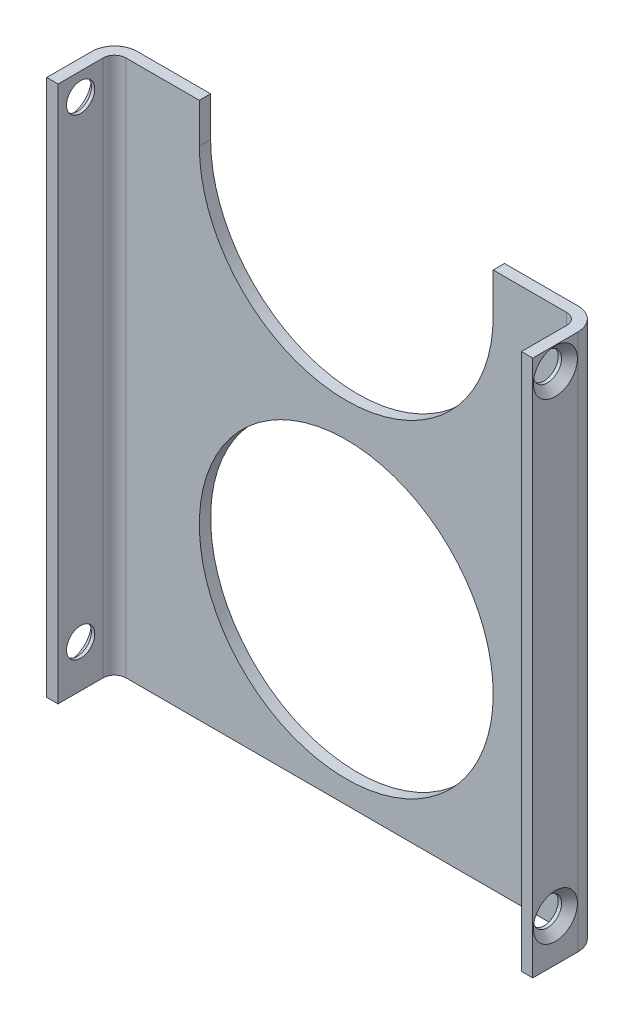
ISO-10303-21;
HEADER;
FILE_DESCRIPTION(('STEP AP214'),'2;1');
FILE_NAME('part.step','',(''),(''),'','','');
FILE_SCHEMA(('AUTOMOTIVE_DESIGN { 1 0 10303 214 1 1 1 1 }'));
ENDSEC;
DATA;
#1=APPLICATION_CONTEXT('core data for automotive mechanical design processes');
#2=APPLICATION_PROTOCOL_DEFINITION('international standard','automotive_design',2000,#1);
#3=PRODUCT_CONTEXT('',#1,'mechanical');
#4=PRODUCT('Part','Part','',(#3));
#5=PRODUCT_RELATED_PRODUCT_CATEGORY('part','',(#4));
#6=PRODUCT_DEFINITION_FORMATION('','',#4);
#7=PRODUCT_DEFINITION_CONTEXT('part definition',#1,'design');
#8=PRODUCT_DEFINITION('design','',#6,#7);
#9=PRODUCT_DEFINITION_SHAPE('','',#8);
#10=(LENGTH_UNIT() NAMED_UNIT(*) SI_UNIT(.MILLI.,.METRE.));
#11=(NAMED_UNIT(*) PLANE_ANGLE_UNIT() SI_UNIT($,.RADIAN.));
#12=(NAMED_UNIT(*) SI_UNIT($,.STERADIAN.) SOLID_ANGLE_UNIT());
#13=UNCERTAINTY_MEASURE_WITH_UNIT(LENGTH_MEASURE(1.E-05),#10,'distance_accuracy_value','');
#14=(GEOMETRIC_REPRESENTATION_CONTEXT(3) GLOBAL_UNCERTAINTY_ASSIGNED_CONTEXT((#13)) GLOBAL_UNIT_ASSIGNED_CONTEXT((#10,
#11,#12)) REPRESENTATION_CONTEXT('',''));
#15=CARTESIAN_POINT('',(0.,0.,0.));
#16=DIRECTION('',(0.,0.,1.));
#17=DIRECTION('',(1.,0.,0.));
#18=AXIS2_PLACEMENT_3D('',#15,#16,#17);
#19=CARTESIAN_POINT('',(0.,0.,2.));
#20=DIRECTION('',(-1.,0.,0.));
#21=DIRECTION('',(0.,0.,1.));
#22=AXIS2_PLACEMENT_3D('',#19,#20,#21);
#23=PLANE('',#22);
#24=CARTESIAN_POINT('',(0.,7.49999999999999,8.));
#25=DIRECTION('',(-1.,0.,0.));
#26=DIRECTION('',(0.,0.,1.));
#27=AXIS2_PLACEMENT_3D('',#24,#25,#26);
#28=CIRCLE('',#27,3.9);
#29=CARTESIAN_POINT('',(0.,7.49999999999999,11.9));
#30=VERTEX_POINT('',#29);
#31=EDGE_CURVE('E299',#30,#30,#28,.T.);
#32=ORIENTED_EDGE('',*,*,#31,.F.);
#33=EDGE_LOOP('',(#32));
#34=FACE_BOUND('',#33,.T.);
#35=DIRECTION('',(0.,0.,-1.));
#36=VECTOR('',#35,1.);
#37=CARTESIAN_POINT('',(0.,95.,2.));
#38=LINE('',#37,#36);
#39=CARTESIAN_POINT('',(0.,94.9999999999999,12.));
#40=VERTEX_POINT('',#39);
#41=CARTESIAN_POINT('',(0.,95.,4.));
#42=VERTEX_POINT('',#41);
#43=EDGE_CURVE('E154',#40,#42,#38,.T.);
#44=ORIENTED_EDGE('',*,*,#43,.T.);
#45=DIRECTION('',(0.,1.,0.));
#46=VECTOR('',#45,1.);
#47=CARTESIAN_POINT('',(0.,88.,4.));
#48=LINE('',#47,#46);
#49=CARTESIAN_POINT('',(0.,0.,4.));
#50=VERTEX_POINT('',#49);
#51=EDGE_CURVE('E286',#42,#50,#48,.F.);
#52=ORIENTED_EDGE('',*,*,#51,.T.);
#53=DIRECTION('',(0.,0.,-1.));
#54=VECTOR('',#53,1.);
#55=CARTESIAN_POINT('',(0.,0.,2.));
#56=LINE('',#55,#54);
#57=CARTESIAN_POINT('',(0.,0.,12.));
#58=VERTEX_POINT('',#57);
#59=EDGE_CURVE('E177',#58,#50,#56,.T.);
#60=ORIENTED_EDGE('',*,*,#59,.F.);
#61=DIRECTION('',(0.,1.,0.));
#62=VECTOR('',#61,1.);
#63=CARTESIAN_POINT('',(0.,0.,12.));
#64=LINE('',#63,#62);
#65=EDGE_CURVE('E171',#58,#40,#64,.T.);
#66=ORIENTED_EDGE('',*,*,#65,.T.);
#67=EDGE_LOOP('',(#44,#52,#60,#66));
#68=FACE_BOUND('',#67,.T.);
#69=CARTESIAN_POINT('',(0.,91.,8.));
#70=DIRECTION('',(-1.,0.,0.));
#71=DIRECTION('',(0.,0.,1.));
#72=AXIS2_PLACEMENT_3D('',#69,#70,#71);
#73=CIRCLE('',#72,3.9);
#74=CARTESIAN_POINT('',(0.,91.,11.9));
#75=VERTEX_POINT('',#74);
#76=EDGE_CURVE('E516',#75,#75,#73,.T.);
#77=ORIENTED_EDGE('',*,*,#76,.F.);
#78=EDGE_LOOP('',(#77));
#79=FACE_BOUND('',#78,.T.);
#80=ADVANCED_FACE('F42',(#34,#68,#79),#23,.T.);
#81=CARTESIAN_POINT('',(1.99999999999999,94.9999999999999,12.));
#82=DIRECTION('',(1.,0.,0.));
#83=DIRECTION('',(0.,1.,0.));
#84=AXIS2_PLACEMENT_3D('',#81,#82,#83);
#85=PLANE('',#84);
#86=CARTESIAN_POINT('',(2.,7.49999999999999,8.));
#87=DIRECTION('',(1.,0.,0.));
#88=DIRECTION('',(0.,1.,0.));
#89=AXIS2_PLACEMENT_3D('',#86,#87,#88);
#90=CIRCLE('',#89,2.5);
#91=CARTESIAN_POINT('',(2.,9.99999999999999,8.));
#92=VERTEX_POINT('',#91);
#93=EDGE_CURVE('E296',#92,#92,#90,.F.);
#94=ORIENTED_EDGE('',*,*,#93,.T.);
#95=EDGE_LOOP('',(#94));
#96=FACE_BOUND('',#95,.T.);
#97=DIRECTION('',(0.,0.,-1.));
#98=VECTOR('',#97,1.);
#99=CARTESIAN_POINT('',(2.,0.,12.));
#100=LINE('',#99,#98);
#101=CARTESIAN_POINT('',(2.,0.,12.));
#102=VERTEX_POINT('',#101);
#103=CARTESIAN_POINT('',(2.,0.,4.));
#104=VERTEX_POINT('',#103);
#105=EDGE_CURVE('E191',#102,#104,#100,.T.);
#106=ORIENTED_EDGE('',*,*,#105,.T.);
#107=DIRECTION('',(0.,1.,0.));
#108=VECTOR('',#107,1.);
#109=CARTESIAN_POINT('',(1.99999999999999,94.9999999999999,4.));
#110=LINE('',#109,#108);
#111=CARTESIAN_POINT('',(1.99999999999999,94.9999999999999,4.));
#112=VERTEX_POINT('',#111);
#113=EDGE_CURVE('E248',#104,#112,#110,.T.);
#114=ORIENTED_EDGE('',*,*,#113,.T.);
#115=DIRECTION('',(0.,0.,-1.));
#116=VECTOR('',#115,1.);
#117=CARTESIAN_POINT('',(1.99999999999999,94.9999999999999,12.));
#118=LINE('',#117,#116);
#119=CARTESIAN_POINT('',(1.99999999999999,94.9999999999999,12.));
#120=VERTEX_POINT('',#119);
#121=EDGE_CURVE('E190',#120,#112,#118,.T.);
#122=ORIENTED_EDGE('',*,*,#121,.F.);
#123=DIRECTION('',(0.,-1.,0.));
#124=VECTOR('',#123,1.);
#125=CARTESIAN_POINT('',(1.99999999999999,94.9999999999999,12.));
#126=LINE('',#125,#124);
#127=EDGE_CURVE('E173',#120,#102,#126,.T.);
#128=ORIENTED_EDGE('',*,*,#127,.T.);
#129=EDGE_LOOP('',(#106,#114,#122,#128));
#130=FACE_BOUND('',#129,.T.);
#131=CARTESIAN_POINT('',(1.99999999999999,91.,8.));
#132=DIRECTION('',(1.,0.,0.));
#133=DIRECTION('',(0.,1.,0.));
#134=AXIS2_PLACEMENT_3D('',#131,#132,#133);
#135=CIRCLE('',#134,2.5);
#136=CARTESIAN_POINT('',(1.99999999999999,93.5,8.));
#137=VERTEX_POINT('',#136);
#138=EDGE_CURVE('E45',#137,#137,#135,.F.);
#139=ORIENTED_EDGE('',*,*,#138,.T.);
#140=EDGE_LOOP('',(#139));
#141=FACE_BOUND('',#140,.T.);
#142=ADVANCED_FACE('F337',(#96,#130,#141),#85,.T.);
#143=CARTESIAN_POINT('',(86.,95.,2.));
#144=DIRECTION('',(1.,0.,0.));
#145=DIRECTION('',(0.,1.,0.));
#146=AXIS2_PLACEMENT_3D('',#143,#144,#145);
#147=PLANE('',#146);
#148=CARTESIAN_POINT('',(86.,91.,8.));
#149=DIRECTION('',(1.,0.,0.));
#150=DIRECTION('',(0.,0.,-1.));
#151=AXIS2_PLACEMENT_3D('',#148,#149,#150);
#152=CIRCLE('',#151,3.9);
#153=CARTESIAN_POINT('',(86.,91.,4.1));
#154=VERTEX_POINT('',#153);
#155=EDGE_CURVE('E294',#154,#154,#152,.T.);
#156=ORIENTED_EDGE('',*,*,#155,.F.);
#157=EDGE_LOOP('',(#156));
#158=FACE_BOUND('',#157,.T.);
#159=DIRECTION('',(0.,0.,-1.));
#160=VECTOR('',#159,1.);
#161=CARTESIAN_POINT('',(86.,0.,2.));
#162=LINE('',#161,#160);
#163=CARTESIAN_POINT('',(86.,0.,12.));
#164=VERTEX_POINT('',#163);
#165=CARTESIAN_POINT('',(86.,0.,4.));
#166=VERTEX_POINT('',#165);
#167=EDGE_CURVE('E249',#164,#166,#162,.T.);
#168=ORIENTED_EDGE('',*,*,#167,.T.);
#169=DIRECTION('',(0.,-1.,0.));
#170=VECTOR('',#169,1.);
#171=CARTESIAN_POINT('',(86.,88.,4.));
#172=LINE('',#171,#170);
#173=CARTESIAN_POINT('',(86.,95.,4.));
#174=VERTEX_POINT('',#173);
#175=EDGE_CURVE('E50',#166,#174,#172,.F.);
#176=ORIENTED_EDGE('',*,*,#175,.T.);
#177=DIRECTION('',(0.,0.,-1.));
#178=VECTOR('',#177,1.);
#179=CARTESIAN_POINT('',(86.,95.,2.));
#180=LINE('',#179,#178);
#181=CARTESIAN_POINT('',(86.,95.,12.));
#182=VERTEX_POINT('',#181);
#183=EDGE_CURVE('E251',#182,#174,#180,.T.);
#184=ORIENTED_EDGE('',*,*,#183,.F.);
#185=DIRECTION('',(0.,-1.,0.));
#186=VECTOR('',#185,1.);
#187=CARTESIAN_POINT('',(86.,95.,12.));
#188=LINE('',#187,#186);
#189=EDGE_CURVE('E194',#182,#164,#188,.T.);
#190=ORIENTED_EDGE('',*,*,#189,.T.);
#191=EDGE_LOOP('',(#168,#176,#184,#190));
#192=FACE_BOUND('',#191,.T.);
#193=CARTESIAN_POINT('',(86.,7.49999999999999,8.));
#194=DIRECTION('',(1.,0.,0.));
#195=DIRECTION('',(0.,0.,-1.));
#196=AXIS2_PLACEMENT_3D('',#193,#194,#195);
#197=CIRCLE('',#196,3.9);
#198=CARTESIAN_POINT('',(86.,7.49999999999999,4.1));
#199=VERTEX_POINT('',#198);
#200=EDGE_CURVE('E298',#199,#199,#197,.T.);
#201=ORIENTED_EDGE('',*,*,#200,.F.);
#202=EDGE_LOOP('',(#201));
#203=FACE_BOUND('',#202,.T.);
#204=ADVANCED_FACE('F342',(#158,#192,#203),#147,.T.);
#205=CARTESIAN_POINT('',(84.,0.,12.));
#206=DIRECTION('',(-1.,0.,0.));
#207=DIRECTION('',(0.,0.,1.));
#208=AXIS2_PLACEMENT_3D('',#205,#206,#207);
#209=PLANE('',#208);
#210=CARTESIAN_POINT('',(84.,91.,8.));
#211=DIRECTION('',(-1.,0.,0.));
#212=DIRECTION('',(0.,0.,1.));
#213=AXIS2_PLACEMENT_3D('',#210,#211,#212);
#214=CIRCLE('',#213,2.5);
#215=CARTESIAN_POINT('',(84.,91.,10.5));
#216=VERTEX_POINT('',#215);
#217=EDGE_CURVE('E179',#216,#216,#214,.F.);
#218=ORIENTED_EDGE('',*,*,#217,.T.);
#219=EDGE_LOOP('',(#218));
#220=FACE_BOUND('',#219,.T.);
#221=DIRECTION('',(0.,0.,-1.));
#222=VECTOR('',#221,1.);
#223=CARTESIAN_POINT('',(84.,95.,12.));
#224=LINE('',#223,#222);
#225=CARTESIAN_POINT('',(84.,95.,12.));
#226=VERTEX_POINT('',#225);
#227=CARTESIAN_POINT('',(84.,95.,4.));
#228=VERTEX_POINT('',#227);
#229=EDGE_CURVE('E207',#226,#228,#224,.T.);
#230=ORIENTED_EDGE('',*,*,#229,.T.);
#231=DIRECTION('',(0.,-1.,0.));
#232=VECTOR('',#231,1.);
#233=CARTESIAN_POINT('',(84.,0.,4.));
#234=LINE('',#233,#232);
#235=CARTESIAN_POINT('',(84.,0.,4.));
#236=VERTEX_POINT('',#235);
#237=EDGE_CURVE('E268',#228,#236,#234,.T.);
#238=ORIENTED_EDGE('',*,*,#237,.T.);
#239=DIRECTION('',(0.,0.,-1.));
#240=VECTOR('',#239,1.);
#241=CARTESIAN_POINT('',(84.,0.,12.));
#242=LINE('',#241,#240);
#243=CARTESIAN_POINT('',(84.,0.,12.));
#244=VERTEX_POINT('',#243);
#245=EDGE_CURVE('E206',#244,#236,#242,.T.);
#246=ORIENTED_EDGE('',*,*,#245,.F.);
#247=DIRECTION('',(0.,1.,0.));
#248=VECTOR('',#247,1.);
#249=CARTESIAN_POINT('',(84.,0.,12.));
#250=LINE('',#249,#248);
#251=EDGE_CURVE('E201',#244,#226,#250,.T.);
#252=ORIENTED_EDGE('',*,*,#251,.T.);
#253=EDGE_LOOP('',(#230,#238,#246,#252));
#254=FACE_BOUND('',#253,.T.);
#255=CARTESIAN_POINT('',(84.,7.49999999999999,8.));
#256=DIRECTION('',(-1.,0.,0.));
#257=DIRECTION('',(0.,0.,1.));
#258=AXIS2_PLACEMENT_3D('',#255,#256,#257);
#259=CIRCLE('',#258,2.49999999999999);
#260=CARTESIAN_POINT('',(84.,7.49999999999999,10.5));
#261=VERTEX_POINT('',#260);
#262=EDGE_CURVE('E292',#261,#261,#259,.F.);
#263=ORIENTED_EDGE('',*,*,#262,.T.);
#264=EDGE_LOOP('',(#263));
#265=FACE_BOUND('',#264,.T.);
#266=ADVANCED_FACE('F347',(#220,#254,#265),#209,.T.);
#267=CARTESIAN_POINT('',(43.,88.,2.));
#268=DIRECTION('',(0.,0.,1.));
#269=DIRECTION('',(1.,0.,0.));
#270=AXIS2_PLACEMENT_3D('',#267,#268,#269);
#271=PLANE('',#270);
#272=DIRECTION('',(-1.,0.,0.));
#273=VECTOR('',#272,1.);
#274=CARTESIAN_POINT('',(17.,95.,2.));
#275=LINE('',#274,#273);
#276=CARTESIAN_POINT('',(17.,95.,2.));
#277=VERTEX_POINT('',#276);
#278=CARTESIAN_POINT('',(3.99999999999999,95.,2.));
#279=VERTEX_POINT('',#278);
#280=EDGE_CURVE('E232',#277,#279,#275,.T.);
#281=ORIENTED_EDGE('',*,*,#280,.T.);
#282=DIRECTION('',(0.,1.,0.));
#283=VECTOR('',#282,1.);
#284=CARTESIAN_POINT('',(3.99999999999999,94.9999999999999,2.));
#285=LINE('',#284,#283);
#286=CARTESIAN_POINT('',(4.,0.,2.));
#287=VERTEX_POINT('',#286);
#288=EDGE_CURVE('E266',#279,#287,#285,.F.);
#289=ORIENTED_EDGE('',*,*,#288,.T.);
#290=DIRECTION('',(1.,0.,0.));
#291=VECTOR('',#290,1.);
#292=CARTESIAN_POINT('',(0.,0.,2.));
#293=LINE('',#292,#291);
#294=CARTESIAN_POINT('',(82.,0.,2.));
#295=VERTEX_POINT('',#294);
#296=EDGE_CURVE('E166',#287,#295,#293,.T.);
#297=ORIENTED_EDGE('',*,*,#296,.T.);
#298=DIRECTION('',(0.,-1.,0.));
#299=VECTOR('',#298,1.);
#300=CARTESIAN_POINT('',(82.,0.,2.));
#301=LINE('',#300,#299);
#302=CARTESIAN_POINT('',(82.,95.,2.));
#303=VERTEX_POINT('',#302);
#304=EDGE_CURVE('E264',#295,#303,#301,.F.);
#305=ORIENTED_EDGE('',*,*,#304,.T.);
#306=DIRECTION('',(-1.,0.,0.));
#307=VECTOR('',#306,1.);
#308=CARTESIAN_POINT('',(86.,95.,2.));
#309=LINE('',#308,#307);
#310=CARTESIAN_POINT('',(69.,95.,2.));
#311=VERTEX_POINT('',#310);
#312=EDGE_CURVE('E243',#303,#311,#309,.T.);
#313=ORIENTED_EDGE('',*,*,#312,.T.);
#314=DIRECTION('',(0.,1.,0.));
#315=VECTOR('',#314,1.);
#316=CARTESIAN_POINT('',(69.,88.,2.));
#317=LINE('',#316,#315);
#318=CARTESIAN_POINT('',(69.,88.,2.));
#319=VERTEX_POINT('',#318);
#320=EDGE_CURVE('E240',#319,#311,#317,.T.);
#321=ORIENTED_EDGE('',*,*,#320,.F.);
#322=CARTESIAN_POINT('',(43.,88.,2.));
#323=DIRECTION('',(0.,0.,1.));
#324=DIRECTION('',(1.,0.,0.));
#325=AXIS2_PLACEMENT_3D('',#322,#323,#324);
#326=CIRCLE('',#325,26.);
#327=CARTESIAN_POINT('',(17.,88.,2.));
#328=VERTEX_POINT('',#327);
#329=EDGE_CURVE('E237',#328,#319,#326,.T.);
#330=ORIENTED_EDGE('',*,*,#329,.F.);
#331=DIRECTION('',(0.,1.,0.));
#332=VECTOR('',#331,1.);
#333=CARTESIAN_POINT('',(17.,88.,2.));
#334=LINE('',#333,#332);
#335=EDGE_CURVE('E235',#328,#277,#334,.T.);
#336=ORIENTED_EDGE('',*,*,#335,.T.);
#337=EDGE_LOOP('',(#281,#289,#297,#305,#313,#321,#330,#336));
#338=FACE_BOUND('',#337,.T.);
#339=CARTESIAN_POINT('',(43.,30.,2.));
#340=DIRECTION('',(0.,0.,1.));
#341=DIRECTION('',(1.,0.,0.));
#342=AXIS2_PLACEMENT_3D('',#339,#340,#341);
#343=CIRCLE('',#342,26.);
#344=CARTESIAN_POINT('',(69.,30.,2.));
#345=VERTEX_POINT('',#344);
#346=EDGE_CURVE('E215',#345,#345,#343,.T.);
#347=ORIENTED_EDGE('',*,*,#346,.F.);
#348=EDGE_LOOP('',(#347));
#349=FACE_BOUND('',#348,.T.);
#350=ADVANCED_FACE('F361',(#338,#349),#271,.T.);
#351=CARTESIAN_POINT('',(43.,88.,0.));
#352=DIRECTION('',(0.,0.,1.));
#353=DIRECTION('',(1.,0.,0.));
#354=AXIS2_PLACEMENT_3D('',#351,#352,#353);
#355=PLANE('',#354);
#356=DIRECTION('',(1.,0.,0.));
#357=VECTOR('',#356,1.);
#358=CARTESIAN_POINT('',(0.,0.,0.));
#359=LINE('',#358,#357);
#360=CARTESIAN_POINT('',(4.,0.,0.));
#361=VERTEX_POINT('',#360);
#362=CARTESIAN_POINT('',(82.,0.,0.));
#363=VERTEX_POINT('',#362);
#364=EDGE_CURVE('E230',#361,#363,#359,.T.);
#365=ORIENTED_EDGE('',*,*,#364,.F.);
#366=DIRECTION('',(0.,1.,0.));
#367=VECTOR('',#366,1.);
#368=CARTESIAN_POINT('',(4.,88.,0.));
#369=LINE('',#368,#367);
#370=CARTESIAN_POINT('',(4.,95.,0.));
#371=VERTEX_POINT('',#370);
#372=EDGE_CURVE('E282',#361,#371,#369,.T.);
#373=ORIENTED_EDGE('',*,*,#372,.T.);
#374=DIRECTION('',(-1.,0.,0.));
#375=VECTOR('',#374,1.);
#376=CARTESIAN_POINT('',(17.,95.,0.));
#377=LINE('',#376,#375);
#378=CARTESIAN_POINT('',(17.,95.,0.));
#379=VERTEX_POINT('',#378);
#380=EDGE_CURVE('E218',#379,#371,#377,.T.);
#381=ORIENTED_EDGE('',*,*,#380,.F.);
#382=DIRECTION('',(0.,1.,0.));
#383=VECTOR('',#382,1.);
#384=CARTESIAN_POINT('',(17.,88.,0.));
#385=LINE('',#384,#383);
#386=CARTESIAN_POINT('',(17.,88.,0.));
#387=VERTEX_POINT('',#386);
#388=EDGE_CURVE('E220',#387,#379,#385,.T.);
#389=ORIENTED_EDGE('',*,*,#388,.F.);
#390=CARTESIAN_POINT('',(43.,88.,0.));
#391=DIRECTION('',(0.,0.,1.));
#392=DIRECTION('',(1.,0.,0.));
#393=AXIS2_PLACEMENT_3D('',#390,#391,#392);
#394=CIRCLE('',#393,26.);
#395=CARTESIAN_POINT('',(69.,88.,0.));
#396=VERTEX_POINT('',#395);
#397=EDGE_CURVE('E222',#387,#396,#394,.T.);
#398=ORIENTED_EDGE('',*,*,#397,.T.);
#399=DIRECTION('',(0.,1.,0.));
#400=VECTOR('',#399,1.);
#401=CARTESIAN_POINT('',(69.,88.,0.));
#402=LINE('',#401,#400);
#403=CARTESIAN_POINT('',(69.,95.,0.));
#404=VERTEX_POINT('',#403);
#405=EDGE_CURVE('E225',#396,#404,#402,.T.);
#406=ORIENTED_EDGE('',*,*,#405,.T.);
#407=DIRECTION('',(-1.,0.,0.));
#408=VECTOR('',#407,1.);
#409=CARTESIAN_POINT('',(86.,95.,0.));
#410=LINE('',#409,#408);
#411=CARTESIAN_POINT('',(82.,95.,0.));
#412=VERTEX_POINT('',#411);
#413=EDGE_CURVE('E228',#412,#404,#410,.T.);
#414=ORIENTED_EDGE('',*,*,#413,.F.);
#415=DIRECTION('',(0.,-1.,0.));
#416=VECTOR('',#415,1.);
#417=CARTESIAN_POINT('',(82.,88.,0.));
#418=LINE('',#417,#416);
#419=EDGE_CURVE('E279',#412,#363,#418,.T.);
#420=ORIENTED_EDGE('',*,*,#419,.T.);
#421=EDGE_LOOP('',(#365,#373,#381,#389,#398,#406,#414,#420));
#422=FACE_BOUND('',#421,.T.);
#423=CARTESIAN_POINT('',(43.,30.,0.));
#424=DIRECTION('',(0.,0.,1.));
#425=DIRECTION('',(1.,0.,0.));
#426=AXIS2_PLACEMENT_3D('',#423,#424,#425);
#427=CIRCLE('',#426,26.);
#428=CARTESIAN_POINT('',(69.,30.,0.));
#429=VERTEX_POINT('',#428);
#430=EDGE_CURVE('E210',#429,#429,#427,.T.);
#431=ORIENTED_EDGE('',*,*,#430,.T.);
#432=EDGE_LOOP('',(#431));
#433=FACE_BOUND('',#432,.T.);
#434=ADVANCED_FACE('F366',(#422,#433),#355,.F.);
#435=CARTESIAN_POINT('',(0.,0.,2.));
#436=DIRECTION('',(0.,1.,0.));
#437=DIRECTION('',(0.,0.,1.));
#438=AXIS2_PLACEMENT_3D('',#435,#436,#437);
#439=PLANE('',#438);
#440=ORIENTED_EDGE('',*,*,#59,.T.);
#441=CARTESIAN_POINT('',(4.,0.,4.));
#442=DIRECTION('',(0.,1.,0.));
#443=DIRECTION('',(0.,0.,1.));
#444=AXIS2_PLACEMENT_3D('',#441,#442,#443);
#445=CIRCLE('',#444,4.);
#446=EDGE_CURVE('E289',#50,#361,#445,.F.);
#447=ORIENTED_EDGE('',*,*,#446,.T.);
#448=ORIENTED_EDGE('',*,*,#364,.T.);
#449=CARTESIAN_POINT('',(82.,0.,4.));
#450=DIRECTION('',(0.,1.,0.));
#451=DIRECTION('',(0.,0.,1.));
#452=AXIS2_PLACEMENT_3D('',#449,#450,#451);
#453=CIRCLE('',#452,4.);
#454=EDGE_CURVE('E65',#363,#166,#453,.F.);
#455=ORIENTED_EDGE('',*,*,#454,.T.);
#456=ORIENTED_EDGE('',*,*,#167,.F.);
#457=DIRECTION('',(1.,0.,0.));
#458=VECTOR('',#457,1.);
#459=CARTESIAN_POINT('',(84.,0.,12.));
#460=LINE('',#459,#458);
#461=EDGE_CURVE('E198',#244,#164,#460,.T.);
#462=ORIENTED_EDGE('',*,*,#461,.F.);
#463=ORIENTED_EDGE('',*,*,#245,.T.);
#464=CARTESIAN_POINT('',(82.,0.,4.));
#465=DIRECTION('',(0.,1.,0.));
#466=DIRECTION('',(0.,0.,1.));
#467=AXIS2_PLACEMENT_3D('',#464,#465,#466);
#468=CIRCLE('',#467,2.);
#469=EDGE_CURVE('E275',#236,#295,#468,.T.);
#470=ORIENTED_EDGE('',*,*,#469,.T.);
#471=ORIENTED_EDGE('',*,*,#296,.F.);
#472=CARTESIAN_POINT('',(4.,0.,4.));
#473=DIRECTION('',(0.,1.,0.));
#474=DIRECTION('',(0.,0.,1.));
#475=AXIS2_PLACEMENT_3D('',#472,#473,#474);
#476=CIRCLE('',#475,2.);
#477=EDGE_CURVE('E273',#287,#104,#476,.T.);
#478=ORIENTED_EDGE('',*,*,#477,.T.);
#479=ORIENTED_EDGE('',*,*,#105,.F.);
#480=DIRECTION('',(1.,0.,0.));
#481=VECTOR('',#480,1.);
#482=CARTESIAN_POINT('',(0.,0.,12.));
#483=LINE('',#482,#481);
#484=EDGE_CURVE('E188',#58,#102,#483,.T.);
#485=ORIENTED_EDGE('',*,*,#484,.F.);
#486=EDGE_LOOP('',(#440,#447,#448,#455,#456,#462,#463,#470,#471,#478,#479,#485));
#487=FACE_BOUND('',#486,.T.);
#488=ADVANCED_FACE('F369',(#487),#439,.F.);
#489=CARTESIAN_POINT('',(86.,95.,2.));
#490=DIRECTION('',(0.,-1.,0.));
#491=DIRECTION('',(1.,0.,0.));
#492=AXIS2_PLACEMENT_3D('',#489,#490,#491);
#493=PLANE('',#492);
#494=ORIENTED_EDGE('',*,*,#183,.T.);
#495=CARTESIAN_POINT('',(82.,95.,4.));
#496=DIRECTION('',(0.,-1.,0.));
#497=DIRECTION('',(1.,0.,0.));
#498=AXIS2_PLACEMENT_3D('',#495,#496,#497);
#499=CIRCLE('',#498,4.);
#500=EDGE_CURVE('E13',#174,#412,#499,.F.);
#501=ORIENTED_EDGE('',*,*,#500,.T.);
#502=ORIENTED_EDGE('',*,*,#413,.T.);
#503=DIRECTION('',(0.,0.,-1.));
#504=VECTOR('',#503,1.);
#505=CARTESIAN_POINT('',(69.,95.,2.));
#506=LINE('',#505,#504);
#507=EDGE_CURVE('E253',#311,#404,#506,.T.);
#508=ORIENTED_EDGE('',*,*,#507,.F.);
#509=ORIENTED_EDGE('',*,*,#312,.F.);
#510=CARTESIAN_POINT('',(82.,95.,4.));
#511=DIRECTION('',(0.,-1.,0.));
#512=DIRECTION('',(1.,0.,0.));
#513=AXIS2_PLACEMENT_3D('',#510,#511,#512);
#514=CIRCLE('',#513,2.);
#515=EDGE_CURVE('E277',#303,#228,#514,.T.);
#516=ORIENTED_EDGE('',*,*,#515,.T.);
#517=ORIENTED_EDGE('',*,*,#229,.F.);
#518=DIRECTION('',(-1.,0.,0.));
#519=VECTOR('',#518,1.);
#520=CARTESIAN_POINT('',(86.,95.,12.));
#521=LINE('',#520,#519);
#522=EDGE_CURVE('E204',#182,#226,#521,.T.);
#523=ORIENTED_EDGE('',*,*,#522,.F.);
#524=EDGE_LOOP('',(#494,#501,#502,#508,#509,#516,#517,#523));
#525=FACE_BOUND('',#524,.T.);
#526=ADVANCED_FACE('F375',(#525),#493,.F.);
#527=CARTESIAN_POINT('',(69.,88.,2.));
#528=DIRECTION('',(-1.,0.,0.));
#529=DIRECTION('',(0.,-1.,0.));
#530=AXIS2_PLACEMENT_3D('',#527,#528,#529);
#531=PLANE('',#530);
#532=ORIENTED_EDGE('',*,*,#405,.F.);
#533=DIRECTION('',(0.,0.,-1.));
#534=VECTOR('',#533,1.);
#535=CARTESIAN_POINT('',(69.,88.,2.));
#536=LINE('',#535,#534);
#537=EDGE_CURVE('E256',#319,#396,#536,.T.);
#538=ORIENTED_EDGE('',*,*,#537,.F.);
#539=ORIENTED_EDGE('',*,*,#320,.T.);
#540=ORIENTED_EDGE('',*,*,#507,.T.);
#541=EDGE_LOOP('',(#532,#538,#539,#540));
#542=FACE_BOUND('',#541,.T.);
#543=ADVANCED_FACE('F379',(#542),#531,.T.);
#544=CARTESIAN_POINT('',(43.,88.,2.));
#545=DIRECTION('',(0.,0.,-1.));
#546=DIRECTION('',(-1.,0.,0.));
#547=AXIS2_PLACEMENT_3D('',#544,#545,#546);
#548=CYLINDRICAL_SURFACE('',#547,26.);
#549=ORIENTED_EDGE('',*,*,#397,.F.);
#550=DIRECTION('',(0.,0.,-1.));
#551=VECTOR('',#550,1.);
#552=CARTESIAN_POINT('',(17.,88.,2.));
#553=LINE('',#552,#551);
#554=EDGE_CURVE('E258',#328,#387,#553,.T.);
#555=ORIENTED_EDGE('',*,*,#554,.F.);
#556=ORIENTED_EDGE('',*,*,#329,.T.);
#557=ORIENTED_EDGE('',*,*,#537,.T.);
#558=EDGE_LOOP('',(#549,#555,#556,#557));
#559=FACE_BOUND('',#558,.T.);
#560=ADVANCED_FACE('F383',(#559),#548,.F.);
#561=CARTESIAN_POINT('',(17.,88.,2.));
#562=DIRECTION('',(-1.,0.,0.));
#563=DIRECTION('',(0.,-1.,0.));
#564=AXIS2_PLACEMENT_3D('',#561,#562,#563);
#565=PLANE('',#564);
#566=ORIENTED_EDGE('',*,*,#388,.T.);
#567=DIRECTION('',(0.,0.,-1.));
#568=VECTOR('',#567,1.);
#569=CARTESIAN_POINT('',(17.,95.,2.));
#570=LINE('',#569,#568);
#571=EDGE_CURVE('E165',#277,#379,#570,.T.);
#572=ORIENTED_EDGE('',*,*,#571,.F.);
#573=ORIENTED_EDGE('',*,*,#335,.F.);
#574=ORIENTED_EDGE('',*,*,#554,.T.);
#575=EDGE_LOOP('',(#566,#572,#573,#574));
#576=FACE_BOUND('',#575,.T.);
#577=ADVANCED_FACE('F387',(#576),#565,.F.);
#578=CARTESIAN_POINT('',(17.,95.,2.));
#579=DIRECTION('',(0.,-1.,0.));
#580=DIRECTION('',(1.,0.,0.));
#581=AXIS2_PLACEMENT_3D('',#578,#579,#580);
#582=PLANE('',#581);
#583=ORIENTED_EDGE('',*,*,#380,.T.);
#584=CARTESIAN_POINT('',(4.,95.,4.));
#585=DIRECTION('',(0.,-1.,0.));
#586=DIRECTION('',(1.,0.,0.));
#587=AXIS2_PLACEMENT_3D('',#584,#585,#586);
#588=CIRCLE('',#587,4.);
#589=EDGE_CURVE('E161',#371,#42,#588,.F.);
#590=ORIENTED_EDGE('',*,*,#589,.T.);
#591=ORIENTED_EDGE('',*,*,#43,.F.);
#592=DIRECTION('',(-1.,0.,0.));
#593=VECTOR('',#592,1.);
#594=CARTESIAN_POINT('',(1.99999999999999,94.9999999999999,12.));
#595=LINE('',#594,#593);
#596=EDGE_CURVE('E159',#120,#40,#595,.T.);
#597=ORIENTED_EDGE('',*,*,#596,.F.);
#598=ORIENTED_EDGE('',*,*,#121,.T.);
#599=CARTESIAN_POINT('',(3.99999999999999,95.,4.));
#600=DIRECTION('',(0.,-1.,0.));
#601=DIRECTION('',(1.,0.,0.));
#602=AXIS2_PLACEMENT_3D('',#599,#600,#601);
#603=CIRCLE('',#602,2.);
#604=EDGE_CURVE('E271',#112,#279,#603,.T.);
#605=ORIENTED_EDGE('',*,*,#604,.T.);
#606=ORIENTED_EDGE('',*,*,#280,.F.);
#607=ORIENTED_EDGE('',*,*,#571,.T.);
#608=EDGE_LOOP('',(#583,#590,#591,#597,#598,#605,#606,#607));
#609=FACE_BOUND('',#608,.T.);
#610=ADVANCED_FACE('F157',(#609),#582,.F.);
#611=CARTESIAN_POINT('',(43.,30.,2.));
#612=DIRECTION('',(0.,0.,-1.));
#613=DIRECTION('',(-1.,0.,0.));
#614=AXIS2_PLACEMENT_3D('',#611,#612,#613);
#615=CYLINDRICAL_SURFACE('',#614,26.);
#616=ORIENTED_EDGE('',*,*,#346,.T.);
#617=EDGE_LOOP('',(#616));
#618=FACE_BOUND('',#617,.T.);
#619=ORIENTED_EDGE('',*,*,#430,.F.);
#620=EDGE_LOOP('',(#619));
#621=FACE_BOUND('',#620,.T.);
#622=ADVANCED_FACE('F357',(#618,#621),#615,.F.);
#623=CARTESIAN_POINT('',(86.,0.,12.));
#624=DIRECTION('',(0.,0.,1.));
#625=DIRECTION('',(1.,0.,0.));
#626=AXIS2_PLACEMENT_3D('',#623,#624,#625);
#627=PLANE('',#626);
#628=ORIENTED_EDGE('',*,*,#189,.F.);
#629=ORIENTED_EDGE('',*,*,#522,.T.);
#630=ORIENTED_EDGE('',*,*,#251,.F.);
#631=ORIENTED_EDGE('',*,*,#461,.T.);
#632=EDGE_LOOP('',(#628,#629,#630,#631));
#633=FACE_BOUND('',#632,.T.);
#634=ADVANCED_FACE('F354',(#633),#627,.T.);
#635=CARTESIAN_POINT('',(0.,0.,12.));
#636=DIRECTION('',(0.,0.,-1.));
#637=DIRECTION('',(-1.,0.,0.));
#638=AXIS2_PLACEMENT_3D('',#635,#636,#637);
#639=PLANE('',#638);
#640=ORIENTED_EDGE('',*,*,#65,.F.);
#641=ORIENTED_EDGE('',*,*,#484,.T.);
#642=ORIENTED_EDGE('',*,*,#127,.F.);
#643=ORIENTED_EDGE('',*,*,#596,.T.);
#644=EDGE_LOOP('',(#640,#641,#642,#643));
#645=FACE_BOUND('',#644,.T.);
#646=ADVANCED_FACE('F170',(#645),#639,.F.);
#647=CARTESIAN_POINT('',(3.99999999999999,94.9999999999999,4.));
#648=DIRECTION('',(0.,-1.,0.));
#649=DIRECTION('',(1.,0.,0.));
#650=AXIS2_PLACEMENT_3D('',#647,#648,#649);
#651=CYLINDRICAL_SURFACE('',#650,2.);
#652=ORIENTED_EDGE('',*,*,#477,.F.);
#653=ORIENTED_EDGE('',*,*,#288,.F.);
#654=ORIENTED_EDGE('',*,*,#604,.F.);
#655=ORIENTED_EDGE('',*,*,#113,.F.);
#656=EDGE_LOOP('',(#652,#653,#654,#655));
#657=FACE_BOUND('',#656,.T.);
#658=ADVANCED_FACE('F410',(#657),#651,.F.);
#659=CARTESIAN_POINT('',(82.,0.,4.));
#660=DIRECTION('',(0.,1.,0.));
#661=DIRECTION('',(0.,0.,1.));
#662=AXIS2_PLACEMENT_3D('',#659,#660,#661);
#663=CYLINDRICAL_SURFACE('',#662,2.);
#664=ORIENTED_EDGE('',*,*,#515,.F.);
#665=ORIENTED_EDGE('',*,*,#304,.F.);
#666=ORIENTED_EDGE('',*,*,#469,.F.);
#667=ORIENTED_EDGE('',*,*,#237,.F.);
#668=EDGE_LOOP('',(#664,#665,#666,#667));
#669=FACE_BOUND('',#668,.T.);
#670=ADVANCED_FACE('F416',(#669),#663,.F.);
#671=CARTESIAN_POINT('',(4.,88.,4.));
#672=DIRECTION('',(0.,-1.,0.));
#673=DIRECTION('',(0.,0.,-1.));
#674=AXIS2_PLACEMENT_3D('',#671,#672,#673);
#675=CYLINDRICAL_SURFACE('',#674,4.);
#676=ORIENTED_EDGE('',*,*,#446,.F.);
#677=ORIENTED_EDGE('',*,*,#51,.F.);
#678=ORIENTED_EDGE('',*,*,#589,.F.);
#679=ORIENTED_EDGE('',*,*,#372,.F.);
#680=EDGE_LOOP('',(#676,#677,#678,#679));
#681=FACE_BOUND('',#680,.T.);
#682=ADVANCED_FACE('F423',(#681),#675,.T.);
#683=CARTESIAN_POINT('',(82.,88.,4.));
#684=DIRECTION('',(0.,1.,0.));
#685=DIRECTION('',(-1.,0.,0.));
#686=AXIS2_PLACEMENT_3D('',#683,#684,#685);
#687=CYLINDRICAL_SURFACE('',#686,4.);
#688=ORIENTED_EDGE('',*,*,#500,.F.);
#689=ORIENTED_EDGE('',*,*,#175,.F.);
#690=ORIENTED_EDGE('',*,*,#454,.F.);
#691=ORIENTED_EDGE('',*,*,#419,.F.);
#692=EDGE_LOOP('',(#688,#689,#690,#691));
#693=FACE_BOUND('',#692,.T.);
#694=ADVANCED_FACE('F333',(#693),#687,.T.);
#695=CARTESIAN_POINT('',(86.,91.,8.));
#696=DIRECTION('',(1.,0.,0.));
#697=DIRECTION('',(0.,0.,-1.));
#698=AXIS2_PLACEMENT_3D('',#695,#696,#697);
#699=CYLINDRICAL_SURFACE('',#698,2.5);
#700=ORIENTED_EDGE('',*,*,#217,.F.);
#701=EDGE_LOOP('',(#700));
#702=FACE_BOUND('',#701,.T.);
#703=CARTESIAN_POINT('',(84.6,91.,8.));
#704=DIRECTION('',(1.,0.,0.));
#705=DIRECTION('',(0.,0.,-1.));
#706=AXIS2_PLACEMENT_3D('',#703,#704,#705);
#707=CIRCLE('',#706,2.49999999999999);
#708=CARTESIAN_POINT('',(84.6,91.,5.50000000000001));
#709=VERTEX_POINT('',#708);
#710=EDGE_CURVE('E182',#709,#709,#707,.T.);
#711=ORIENTED_EDGE('',*,*,#710,.T.);
#712=EDGE_LOOP('',(#711));
#713=FACE_BOUND('',#712,.T.);
#714=ADVANCED_FACE('F320',(#702,#713),#699,.F.);
#715=CARTESIAN_POINT('',(84.6,91.,8.));
#716=DIRECTION('',(1.,0.,0.));
#717=DIRECTION('',(0.,0.,-1.));
#718=AXIS2_PLACEMENT_3D('',#715,#716,#717);
#719=CONICAL_SURFACE('',#718,2.49999999999999,0.785398163397448);
#720=ORIENTED_EDGE('',*,*,#155,.T.);
#721=EDGE_LOOP('',(#720));
#722=FACE_BOUND('',#721,.T.);
#723=ORIENTED_EDGE('',*,*,#710,.F.);
#724=EDGE_LOOP('',(#723));
#725=FACE_BOUND('',#724,.T.);
#726=ADVANCED_FACE('F322',(#722,#725),#719,.F.);
#727=CARTESIAN_POINT('',(86.,7.49999999999999,8.));
#728=DIRECTION('',(1.,0.,0.));
#729=DIRECTION('',(0.,0.,-1.));
#730=AXIS2_PLACEMENT_3D('',#727,#728,#729);
#731=CYLINDRICAL_SURFACE('',#730,2.49999999999999);
#732=ORIENTED_EDGE('',*,*,#262,.F.);
#733=EDGE_LOOP('',(#732));
#734=FACE_BOUND('',#733,.T.);
#735=CARTESIAN_POINT('',(84.6,7.49999999999999,8.));
#736=DIRECTION('',(1.,0.,0.));
#737=DIRECTION('',(0.,0.,-1.));
#738=AXIS2_PLACEMENT_3D('',#735,#736,#737);
#739=CIRCLE('',#738,2.49999999999999);
#740=CARTESIAN_POINT('',(84.6,7.49999999999999,5.50000000000001));
#741=VERTEX_POINT('',#740);
#742=EDGE_CURVE('E295',#741,#741,#739,.T.);
#743=ORIENTED_EDGE('',*,*,#742,.T.);
#744=EDGE_LOOP('',(#743));
#745=FACE_BOUND('',#744,.T.);
#746=ADVANCED_FACE('F324',(#734,#745),#731,.F.);
#747=CARTESIAN_POINT('',(84.6,7.49999999999999,8.));
#748=DIRECTION('',(1.,0.,0.));
#749=DIRECTION('',(0.,0.,-1.));
#750=AXIS2_PLACEMENT_3D('',#747,#748,#749);
#751=CONICAL_SURFACE('',#750,2.49999999999999,0.785398163397449);
#752=ORIENTED_EDGE('',*,*,#200,.T.);
#753=EDGE_LOOP('',(#752));
#754=FACE_BOUND('',#753,.T.);
#755=ORIENTED_EDGE('',*,*,#742,.F.);
#756=EDGE_LOOP('',(#755));
#757=FACE_BOUND('',#756,.T.);
#758=ADVANCED_FACE('F330',(#754,#757),#751,.F.);
#759=CARTESIAN_POINT('',(1.39999999999999,7.49999999999999,8.));
#760=DIRECTION('',(-1.,0.,0.));
#761=DIRECTION('',(0.,0.,1.));
#762=AXIS2_PLACEMENT_3D('',#759,#760,#761);
#763=CONICAL_SURFACE('',#762,2.5,0.785398163397453);
#764=ORIENTED_EDGE('',*,*,#31,.T.);
#765=EDGE_LOOP('',(#764));
#766=FACE_BOUND('',#765,.T.);
#767=CARTESIAN_POINT('',(1.39999999999999,7.49999999999999,8.));
#768=DIRECTION('',(-1.,0.,0.));
#769=DIRECTION('',(0.,0.,1.));
#770=AXIS2_PLACEMENT_3D('',#767,#768,#769);
#771=CIRCLE('',#770,2.5);
#772=CARTESIAN_POINT('',(1.39999999999999,7.49999999999999,10.5));
#773=VERTEX_POINT('',#772);
#774=EDGE_CURVE('E305',#773,#773,#771,.T.);
#775=ORIENTED_EDGE('',*,*,#774,.F.);
#776=EDGE_LOOP('',(#775));
#777=FACE_BOUND('',#776,.T.);
#778=ADVANCED_FACE('F464',(#766,#777),#763,.F.);
#779=CARTESIAN_POINT('',(0.,7.49999999999999,8.));
#780=DIRECTION('',(-1.,0.,0.));
#781=DIRECTION('',(0.,0.,1.));
#782=AXIS2_PLACEMENT_3D('',#779,#780,#781);
#783=CYLINDRICAL_SURFACE('',#782,2.5);
#784=ORIENTED_EDGE('',*,*,#93,.F.);
#785=EDGE_LOOP('',(#784));
#786=FACE_BOUND('',#785,.T.);
#787=ORIENTED_EDGE('',*,*,#774,.T.);
#788=EDGE_LOOP('',(#787));
#789=FACE_BOUND('',#788,.T.);
#790=ADVANCED_FACE('F474',(#786,#789),#783,.F.);
#791=CARTESIAN_POINT('',(1.39999999999999,91.,8.));
#792=DIRECTION('',(-1.,0.,0.));
#793=DIRECTION('',(0.,0.,1.));
#794=AXIS2_PLACEMENT_3D('',#791,#792,#793);
#795=CONICAL_SURFACE('',#794,2.5,0.785398163397451);
#796=ORIENTED_EDGE('',*,*,#76,.T.);
#797=EDGE_LOOP('',(#796));
#798=FACE_BOUND('',#797,.T.);
#799=CARTESIAN_POINT('',(1.39999999999999,91.,8.));
#800=DIRECTION('',(-1.,0.,0.));
#801=DIRECTION('',(0.,0.,1.));
#802=AXIS2_PLACEMENT_3D('',#799,#800,#801);
#803=CIRCLE('',#802,2.5);
#804=CARTESIAN_POINT('',(1.39999999999999,91.,10.5));
#805=VERTEX_POINT('',#804);
#806=EDGE_CURVE('E514',#805,#805,#803,.T.);
#807=ORIENTED_EDGE('',*,*,#806,.F.);
#808=EDGE_LOOP('',(#807));
#809=FACE_BOUND('',#808,.T.);
#810=ADVANCED_FACE('F483',(#798,#809),#795,.F.);
#811=CARTESIAN_POINT('',(0.,91.,8.));
#812=DIRECTION('',(-1.,0.,0.));
#813=DIRECTION('',(0.,0.,1.));
#814=AXIS2_PLACEMENT_3D('',#811,#812,#813);
#815=CYLINDRICAL_SURFACE('',#814,2.5);
#816=ORIENTED_EDGE('',*,*,#138,.F.);
#817=EDGE_LOOP('',(#816));
#818=FACE_BOUND('',#817,.T.);
#819=ORIENTED_EDGE('',*,*,#806,.T.);
#820=EDGE_LOOP('',(#819));
#821=FACE_BOUND('',#820,.T.);
#822=ADVANCED_FACE('F494',(#818,#821),#815,.F.);
#823=CLOSED_SHELL('',(#80,#142,#204,#266,#350,#434,#488,#526,#543,#560,#577,#610,#622,#634,#646,
#658,#670,#682,#694,#714,#726,#746,#758,#778,#790,#810,#822));
#824=MANIFOLD_SOLID_BREP('B2',#823);
#825=ADVANCED_BREP_SHAPE_REPRESENTATION('',(#18,#824),#14);
#826=SHAPE_DEFINITION_REPRESENTATION(#9,#825);
ENDSEC;
END-ISO-10303-21;
